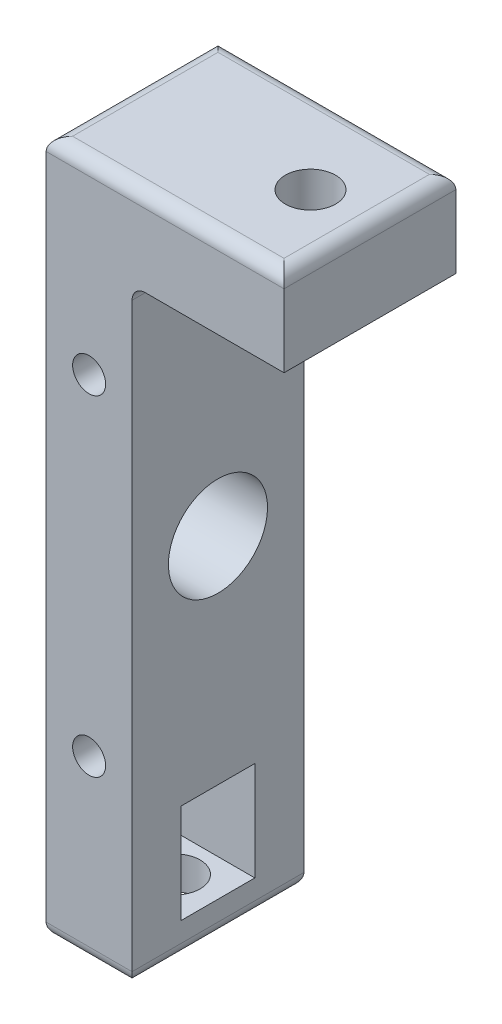
ISO-10303-21;
HEADER;
FILE_DESCRIPTION(('STEP AP214'),'2;1');
FILE_NAME('part.step','',(''),(''),'','','');
FILE_SCHEMA(('AUTOMOTIVE_DESIGN { 1 0 10303 214 1 1 1 1 }'));
ENDSEC;
DATA;
#1=APPLICATION_CONTEXT('core data for automotive mechanical design processes');
#2=APPLICATION_PROTOCOL_DEFINITION('international standard','automotive_design',2000,#1);
#3=PRODUCT_CONTEXT('',#1,'mechanical');
#4=PRODUCT('Part','Part','',(#3));
#5=PRODUCT_RELATED_PRODUCT_CATEGORY('part','',(#4));
#6=PRODUCT_DEFINITION_FORMATION('','',#4);
#7=PRODUCT_DEFINITION_CONTEXT('part definition',#1,'design');
#8=PRODUCT_DEFINITION('design','',#6,#7);
#9=PRODUCT_DEFINITION_SHAPE('','',#8);
#10=(LENGTH_UNIT() NAMED_UNIT(*) SI_UNIT(.MILLI.,.METRE.));
#11=(NAMED_UNIT(*) PLANE_ANGLE_UNIT() SI_UNIT($,.RADIAN.));
#12=(NAMED_UNIT(*) SI_UNIT($,.STERADIAN.) SOLID_ANGLE_UNIT());
#13=UNCERTAINTY_MEASURE_WITH_UNIT(LENGTH_MEASURE(1.E-05),#10,'distance_accuracy_value','');
#14=(GEOMETRIC_REPRESENTATION_CONTEXT(3) GLOBAL_UNCERTAINTY_ASSIGNED_CONTEXT((#13)) GLOBAL_UNIT_ASSIGNED_CONTEXT((#10,
#11,#12)) REPRESENTATION_CONTEXT('',''));
#15=CARTESIAN_POINT('',(0.,0.,0.));
#16=DIRECTION('',(0.,0.,1.));
#17=DIRECTION('',(1.,0.,0.));
#18=AXIS2_PLACEMENT_3D('',#15,#16,#17);
#19=CARTESIAN_POINT('',(0.,-16.51,33.02));
#20=DIRECTION('',(-1.,0.,0.));
#21=DIRECTION('',(0.,0.,1.));
#22=AXIS2_PLACEMENT_3D('',#19,#20,#21);
#23=PLANE('',#22);
#24=DIRECTION('',(0.,1.,0.));
#25=VECTOR('',#24,1.);
#26=CARTESIAN_POINT('',(0.,-16.51,0.));
#27=LINE('',#26,#25);
#28=CARTESIAN_POINT('',(0.,-16.51,0.));
#29=VERTEX_POINT('',#28);
#30=CARTESIAN_POINT('',(0.,-2.54,0.));
#31=VERTEX_POINT('',#30);
#32=EDGE_CURVE('E225',#29,#31,#27,.T.);
#33=ORIENTED_EDGE('',*,*,#32,.T.);
#34=DIRECTION('',(0.,0.,-1.));
#35=VECTOR('',#34,1.);
#36=CARTESIAN_POINT('',(0.,-2.54,33.02));
#37=LINE('',#36,#35);
#38=CARTESIAN_POINT('',(0.,-2.54,33.02));
#39=VERTEX_POINT('',#38);
#40=EDGE_CURVE('E253',#31,#39,#37,.F.);
#41=ORIENTED_EDGE('',*,*,#40,.T.);
#42=DIRECTION('',(0.,1.,0.));
#43=VECTOR('',#42,1.);
#44=CARTESIAN_POINT('',(0.,-16.51,33.02));
#45=LINE('',#44,#43);
#46=CARTESIAN_POINT('',(0.,-16.51,33.02));
#47=VERTEX_POINT('',#46);
#48=EDGE_CURVE('E213',#47,#39,#45,.T.);
#49=ORIENTED_EDGE('',*,*,#48,.F.);
#50=DIRECTION('',(0.,0.,-1.));
#51=VECTOR('',#50,1.);
#52=CARTESIAN_POINT('',(0.,-16.51,33.02));
#53=LINE('',#52,#51);
#54=EDGE_CURVE('E224',#47,#29,#53,.T.);
#55=ORIENTED_EDGE('',*,*,#54,.T.);
#56=EDGE_LOOP('',(#33,#41,#49,#55));
#57=FACE_BOUND('',#56,.T.);
#58=ADVANCED_FACE('F40',(#57),#23,.F.);
#59=CARTESIAN_POINT('',(0.,0.,33.02));
#60=DIRECTION('',(0.,-1.,0.));
#61=DIRECTION('',(1.,0.,0.));
#62=AXIS2_PLACEMENT_3D('',#59,#60,#61);
#63=PLANE('',#62);
#64=CARTESIAN_POINT('',(-11.43,0.,16.51));
#65=DIRECTION('',(0.,1.,0.));
#66=DIRECTION('',(-1.,0.,0.));
#67=AXIS2_PLACEMENT_3D('',#64,#65,#66);
#68=CIRCLE('',#67,4.826);
#69=CARTESIAN_POINT('',(-16.256,0.,16.51));
#70=VERTEX_POINT('',#69);
#71=EDGE_CURVE('E267',#70,#70,#68,.T.);
#72=ORIENTED_EDGE('',*,*,#71,.F.);
#73=EDGE_LOOP('',(#72));
#74=FACE_BOUND('',#73,.T.);
#75=DIRECTION('',(-1.,0.,0.));
#76=VECTOR('',#75,1.);
#77=CARTESIAN_POINT('',(0.,0.,2.54));
#78=LINE('',#77,#76);
#79=CARTESIAN_POINT('',(-2.54,0.,2.54));
#80=VERTEX_POINT('',#79);
#81=CARTESIAN_POINT('',(-43.18,0.,2.54));
#82=VERTEX_POINT('',#81);
#83=EDGE_CURVE('E244',#80,#82,#78,.T.);
#84=ORIENTED_EDGE('',*,*,#83,.T.);
#85=DIRECTION('',(0.,0.,-1.));
#86=VECTOR('',#85,1.);
#87=CARTESIAN_POINT('',(-43.18,0.,33.02));
#88=LINE('',#87,#86);
#89=CARTESIAN_POINT('',(-43.18,0.,30.48));
#90=VERTEX_POINT('',#89);
#91=EDGE_CURVE('E246',#82,#90,#88,.F.);
#92=ORIENTED_EDGE('',*,*,#91,.T.);
#93=DIRECTION('',(-1.,0.,0.));
#94=VECTOR('',#93,1.);
#95=CARTESIAN_POINT('',(0.,0.,30.48));
#96=LINE('',#95,#94);
#97=CARTESIAN_POINT('',(-2.54,0.,30.48));
#98=VERTEX_POINT('',#97);
#99=EDGE_CURVE('E242',#90,#98,#96,.F.);
#100=ORIENTED_EDGE('',*,*,#99,.T.);
#101=DIRECTION('',(0.,0.,-1.));
#102=VECTOR('',#101,1.);
#103=CARTESIAN_POINT('',(-2.54,0.,33.02));
#104=LINE('',#103,#102);
#105=EDGE_CURVE('E240',#98,#80,#104,.T.);
#106=ORIENTED_EDGE('',*,*,#105,.T.);
#107=EDGE_LOOP('',(#84,#92,#100,#106));
#108=FACE_BOUND('',#107,.T.);
#109=ADVANCED_FACE('F324',(#74,#108),#63,.F.);
#110=CARTESIAN_POINT('',(-45.72,0.,33.02));
#111=DIRECTION('',(1.,0.,0.));
#112=DIRECTION('',(0.,1.,0.));
#113=AXIS2_PLACEMENT_3D('',#110,#111,#112);
#114=PLANE('',#113);
#115=DIRECTION('',(0.,0.,-1.));
#116=VECTOR('',#115,1.);
#117=CARTESIAN_POINT('',(-45.72,-127.,23.5966));
#118=LINE('',#117,#116);
#119=CARTESIAN_POINT('',(-45.72,-127.,23.5966));
#120=VERTEX_POINT('',#119);
#121=CARTESIAN_POINT('',(-45.72,-127.,9.42339999999998));
#122=VERTEX_POINT('',#121);
#123=EDGE_CURVE('E159',#120,#122,#118,.T.);
#124=ORIENTED_EDGE('',*,*,#123,.T.);
#125=DIRECTION('',(0.,1.,0.));
#126=VECTOR('',#125,1.);
#127=CARTESIAN_POINT('',(-45.72,-107.95,9.42339999999998));
#128=LINE('',#127,#126);
#129=CARTESIAN_POINT('',(-45.72,-107.95,9.42339999999998));
#130=VERTEX_POINT('',#129);
#131=EDGE_CURVE('E151',#122,#130,#128,.T.);
#132=ORIENTED_EDGE('',*,*,#131,.T.);
#133=DIRECTION('',(0.,0.,1.));
#134=VECTOR('',#133,1.);
#135=CARTESIAN_POINT('',(-45.72,-107.95,23.5966));
#136=LINE('',#135,#134);
#137=CARTESIAN_POINT('',(-45.72,-107.95,23.5966));
#138=VERTEX_POINT('',#137);
#139=EDGE_CURVE('E163',#130,#138,#136,.T.);
#140=ORIENTED_EDGE('',*,*,#139,.T.);
#141=DIRECTION('',(0.,-1.,0.));
#142=VECTOR('',#141,1.);
#143=CARTESIAN_POINT('',(-45.72,-107.95,23.5966));
#144=LINE('',#143,#142);
#145=EDGE_CURVE('E167',#138,#120,#144,.T.);
#146=ORIENTED_EDGE('',*,*,#145,.T.);
#147=EDGE_LOOP('',(#124,#132,#140,#146));
#148=FACE_BOUND('',#147,.T.);
#149=CARTESIAN_POINT('',(-45.72,-66.548,16.51));
#150=DIRECTION('',(1.,0.,0.));
#151=DIRECTION('',(0.,1.,0.));
#152=AXIS2_PLACEMENT_3D('',#149,#150,#151);
#153=CIRCLE('',#152,9.525);
#154=CARTESIAN_POINT('',(-45.72,-57.023,16.51));
#155=VERTEX_POINT('',#154);
#156=EDGE_CURVE('E207',#155,#155,#153,.T.);
#157=ORIENTED_EDGE('',*,*,#156,.T.);
#158=EDGE_LOOP('',(#157));
#159=FACE_BOUND('',#158,.T.);
#160=DIRECTION('',(0.,-1.,0.));
#161=VECTOR('',#160,1.);
#162=CARTESIAN_POINT('',(-45.72,0.,0.));
#163=LINE('',#162,#161);
#164=CARTESIAN_POINT('',(-45.72,-2.54000000000001,0.));
#165=VERTEX_POINT('',#164);
#166=CARTESIAN_POINT('',(-45.72,-130.81,0.));
#167=VERTEX_POINT('',#166);
#168=EDGE_CURVE('E228',#165,#167,#163,.T.);
#169=ORIENTED_EDGE('',*,*,#168,.T.);
#170=DIRECTION('',(0.,0.,-1.));
#171=VECTOR('',#170,1.);
#172=CARTESIAN_POINT('',(-45.72,-130.81,33.02));
#173=LINE('',#172,#171);
#174=CARTESIAN_POINT('',(-45.72,-130.81,33.02));
#175=VERTEX_POINT('',#174);
#176=EDGE_CURVE('E279',#167,#175,#173,.F.);
#177=ORIENTED_EDGE('',*,*,#176,.T.);
#178=DIRECTION('',(0.,-1.,0.));
#179=VECTOR('',#178,1.);
#180=CARTESIAN_POINT('',(-45.72,0.,33.02));
#181=LINE('',#180,#179);
#182=CARTESIAN_POINT('',(-45.72,-2.54000000000001,33.02));
#183=VERTEX_POINT('',#182);
#184=EDGE_CURVE('E216',#183,#175,#181,.T.);
#185=ORIENTED_EDGE('',*,*,#184,.F.);
#186=DIRECTION('',(0.,0.,-1.));
#187=VECTOR('',#186,1.);
#188=CARTESIAN_POINT('',(-45.72,-2.54000000000001,33.02));
#189=LINE('',#188,#187);
#190=EDGE_CURVE('E237',#183,#165,#189,.T.);
#191=ORIENTED_EDGE('',*,*,#190,.T.);
#192=EDGE_LOOP('',(#169,#177,#185,#191));
#193=FACE_BOUND('',#192,.T.);
#194=ADVANCED_FACE('F169',(#148,#159,#193),#114,.F.);
#195=CARTESIAN_POINT('',(-45.72,-133.35,33.02));
#196=DIRECTION('',(0.,1.,0.));
#197=DIRECTION('',(0.,0.,1.));
#198=AXIS2_PLACEMENT_3D('',#195,#196,#197);
#199=PLANE('',#198);
#200=DIRECTION('',(0.,0.,-1.));
#201=VECTOR('',#200,1.);
#202=CARTESIAN_POINT('',(-43.18,-133.35,33.02));
#203=LINE('',#202,#201);
#204=CARTESIAN_POINT('',(-43.18,-133.35,30.48));
#205=VERTEX_POINT('',#204);
#206=CARTESIAN_POINT('',(-43.18,-133.35,2.54));
#207=VERTEX_POINT('',#206);
#208=EDGE_CURVE('E271',#205,#207,#203,.T.);
#209=ORIENTED_EDGE('',*,*,#208,.T.);
#210=DIRECTION('',(1.,0.,0.));
#211=VECTOR('',#210,1.);
#212=CARTESIAN_POINT('',(-45.72,-133.35,2.54));
#213=LINE('',#212,#211);
#214=CARTESIAN_POINT('',(-31.75,-133.35,2.54));
#215=VERTEX_POINT('',#214);
#216=EDGE_CURVE('E273',#207,#215,#213,.T.);
#217=ORIENTED_EDGE('',*,*,#216,.T.);
#218=DIRECTION('',(0.,0.,-1.));
#219=VECTOR('',#218,1.);
#220=CARTESIAN_POINT('',(-31.75,-133.35,33.02));
#221=LINE('',#220,#219);
#222=CARTESIAN_POINT('',(-31.75,-133.35,30.48));
#223=VERTEX_POINT('',#222);
#224=EDGE_CURVE('E255',#215,#223,#221,.F.);
#225=ORIENTED_EDGE('',*,*,#224,.T.);
#226=DIRECTION('',(1.,0.,0.));
#227=VECTOR('',#226,1.);
#228=CARTESIAN_POINT('',(-45.72,-133.35,30.48));
#229=LINE('',#228,#227);
#230=EDGE_CURVE('E269',#223,#205,#229,.F.);
#231=ORIENTED_EDGE('',*,*,#230,.T.);
#232=EDGE_LOOP('',(#209,#217,#225,#231));
#233=FACE_BOUND('',#232,.T.);
#234=CARTESIAN_POINT('',(-37.465,-133.35,16.51));
#235=DIRECTION('',(0.,-1.,0.));
#236=DIRECTION('',(0.,0.,-1.));
#237=AXIS2_PLACEMENT_3D('',#234,#235,#236);
#238=CIRCLE('',#237,4.826);
#239=CARTESIAN_POINT('',(-37.465,-133.35,11.684));
#240=VERTEX_POINT('',#239);
#241=EDGE_CURVE('E178',#240,#240,#238,.T.);
#242=ORIENTED_EDGE('',*,*,#241,.F.);
#243=EDGE_LOOP('',(#242));
#244=FACE_BOUND('',#243,.T.);
#245=ADVANCED_FACE('F355',(#233,#244),#199,.F.);
#246=CARTESIAN_POINT('',(-29.21,-133.35,33.02));
#247=DIRECTION('',(-1.,0.,0.));
#248=DIRECTION('',(0.,-1.,0.));
#249=AXIS2_PLACEMENT_3D('',#246,#247,#248);
#250=PLANE('',#249);
#251=DIRECTION('',(0.,0.,1.));
#252=VECTOR('',#251,1.);
#253=CARTESIAN_POINT('',(-29.21,-107.95,23.5966));
#254=LINE('',#253,#252);
#255=CARTESIAN_POINT('',(-29.21,-107.95,9.42339999999998));
#256=VERTEX_POINT('',#255);
#257=CARTESIAN_POINT('',(-29.21,-107.95,23.5966));
#258=VERTEX_POINT('',#257);
#259=EDGE_CURVE('E184',#256,#258,#254,.T.);
#260=ORIENTED_EDGE('',*,*,#259,.F.);
#261=DIRECTION('',(0.,1.,0.));
#262=VECTOR('',#261,1.);
#263=CARTESIAN_POINT('',(-29.21,-107.95,9.42339999999998));
#264=LINE('',#263,#262);
#265=CARTESIAN_POINT('',(-29.21,-127.,9.42339999999998));
#266=VERTEX_POINT('',#265);
#267=EDGE_CURVE('E154',#266,#256,#264,.T.);
#268=ORIENTED_EDGE('',*,*,#267,.F.);
#269=DIRECTION('',(0.,0.,-1.));
#270=VECTOR('',#269,1.);
#271=CARTESIAN_POINT('',(-29.21,-127.,23.5966));
#272=LINE('',#271,#270);
#273=CARTESIAN_POINT('',(-29.21,-127.,23.5966));
#274=VERTEX_POINT('',#273);
#275=EDGE_CURVE('E172',#274,#266,#272,.T.);
#276=ORIENTED_EDGE('',*,*,#275,.F.);
#277=DIRECTION('',(0.,-1.,0.));
#278=VECTOR('',#277,1.);
#279=CARTESIAN_POINT('',(-29.21,-107.95,23.5966));
#280=LINE('',#279,#278);
#281=EDGE_CURVE('E175',#258,#274,#280,.T.);
#282=ORIENTED_EDGE('',*,*,#281,.F.);
#283=EDGE_LOOP('',(#260,#268,#276,#282));
#284=FACE_BOUND('',#283,.T.);
#285=CARTESIAN_POINT('',(-29.21,-66.548,16.51));
#286=DIRECTION('',(1.,0.,0.));
#287=DIRECTION('',(0.,1.,0.));
#288=AXIS2_PLACEMENT_3D('',#285,#286,#287);
#289=CIRCLE('',#288,9.525);
#290=CARTESIAN_POINT('',(-29.21,-57.023,16.51));
#291=VERTEX_POINT('',#290);
#292=EDGE_CURVE('E198',#291,#291,#289,.T.);
#293=ORIENTED_EDGE('',*,*,#292,.F.);
#294=EDGE_LOOP('',(#293));
#295=FACE_BOUND('',#294,.T.);
#296=DIRECTION('',(0.,1.,0.));
#297=VECTOR('',#296,1.);
#298=CARTESIAN_POINT('',(-29.21,-133.35,0.));
#299=LINE('',#298,#297);
#300=CARTESIAN_POINT('',(-29.21,-130.81,0.));
#301=VERTEX_POINT('',#300);
#302=CARTESIAN_POINT('',(-29.21,-19.05,0.));
#303=VERTEX_POINT('',#302);
#304=EDGE_CURVE('E232',#301,#303,#299,.T.);
#305=ORIENTED_EDGE('',*,*,#304,.T.);
#306=DIRECTION('',(0.,0.,-1.));
#307=VECTOR('',#306,1.);
#308=CARTESIAN_POINT('',(-29.21,-19.05,33.02));
#309=LINE('',#308,#307);
#310=CARTESIAN_POINT('',(-29.21,-19.05,33.02));
#311=VERTEX_POINT('',#310);
#312=EDGE_CURVE('E61',#303,#311,#309,.F.);
#313=ORIENTED_EDGE('',*,*,#312,.T.);
#314=DIRECTION('',(0.,1.,0.));
#315=VECTOR('',#314,1.);
#316=CARTESIAN_POINT('',(-29.21,-133.35,33.02));
#317=LINE('',#316,#315);
#318=CARTESIAN_POINT('',(-29.21,-130.81,33.02));
#319=VERTEX_POINT('',#318);
#320=EDGE_CURVE('E220',#319,#311,#317,.T.);
#321=ORIENTED_EDGE('',*,*,#320,.F.);
#322=DIRECTION('',(0.,0.,-1.));
#323=VECTOR('',#322,1.);
#324=CARTESIAN_POINT('',(-29.21,-130.81,33.02));
#325=LINE('',#324,#323);
#326=EDGE_CURVE('E283',#319,#301,#325,.T.);
#327=ORIENTED_EDGE('',*,*,#326,.T.);
#328=EDGE_LOOP('',(#305,#313,#321,#327));
#329=FACE_BOUND('',#328,.T.);
#330=ADVANCED_FACE('F359',(#284,#295,#329),#250,.F.);
#331=CARTESIAN_POINT('',(-29.21,-16.51,33.02));
#332=DIRECTION('',(0.,1.,0.));
#333=DIRECTION('',(0.,0.,1.));
#334=AXIS2_PLACEMENT_3D('',#331,#332,#333);
#335=PLANE('',#334);
#336=CARTESIAN_POINT('',(-11.43,-16.51,16.51));
#337=DIRECTION('',(0.,1.,0.));
#338=DIRECTION('',(0.,0.,1.));
#339=AXIS2_PLACEMENT_3D('',#336,#337,#338);
#340=CIRCLE('',#339,4.826);
#341=CARTESIAN_POINT('',(-11.43,-16.51,21.336));
#342=VERTEX_POINT('',#341);
#343=EDGE_CURVE('E264',#342,#342,#340,.T.);
#344=ORIENTED_EDGE('',*,*,#343,.T.);
#345=EDGE_LOOP('',(#344));
#346=FACE_BOUND('',#345,.T.);
#347=DIRECTION('',(1.,0.,0.));
#348=VECTOR('',#347,1.);
#349=CARTESIAN_POINT('',(-29.21,-16.51,33.02));
#350=LINE('',#349,#348);
#351=CARTESIAN_POINT('',(-26.67,-16.51,33.02));
#352=VERTEX_POINT('',#351);
#353=EDGE_CURVE('E222',#352,#47,#350,.T.);
#354=ORIENTED_EDGE('',*,*,#353,.F.);
#355=DIRECTION('',(0.,0.,-1.));
#356=VECTOR('',#355,1.);
#357=CARTESIAN_POINT('',(-26.67,-16.51,0.));
#358=LINE('',#357,#356);
#359=CARTESIAN_POINT('',(-26.67,-16.51,0.));
#360=VERTEX_POINT('',#359);
#361=EDGE_CURVE('E285',#352,#360,#358,.T.);
#362=ORIENTED_EDGE('',*,*,#361,.T.);
#363=DIRECTION('',(1.,0.,0.));
#364=VECTOR('',#363,1.);
#365=CARTESIAN_POINT('',(-29.21,-16.51,0.));
#366=LINE('',#365,#364);
#367=EDGE_CURVE('E217',#360,#29,#366,.T.);
#368=ORIENTED_EDGE('',*,*,#367,.T.);
#369=ORIENTED_EDGE('',*,*,#54,.F.);
#370=EDGE_LOOP('',(#354,#362,#368,#369));
#371=FACE_BOUND('',#370,.T.);
#372=ADVANCED_FACE('F301',(#346,#371),#335,.F.);
#373=CARTESIAN_POINT('',(0.,0.,33.02));
#374=DIRECTION('',(0.,0.,1.));
#375=DIRECTION('',(1.,0.,0.));
#376=AXIS2_PLACEMENT_3D('',#373,#374,#375);
#377=PLANE('',#376);
#378=CARTESIAN_POINT('',(-37.465,-35.56,33.02));
#379=DIRECTION('',(0.,0.,1.));
#380=DIRECTION('',(1.,0.,0.));
#381=AXIS2_PLACEMENT_3D('',#378,#379,#380);
#382=CIRCLE('',#381,3.175);
#383=CARTESIAN_POINT('',(-34.29,-35.56,33.02));
#384=VERTEX_POINT('',#383);
#385=EDGE_CURVE('E199',#384,#384,#382,.T.);
#386=ORIENTED_EDGE('',*,*,#385,.F.);
#387=EDGE_LOOP('',(#386));
#388=FACE_BOUND('',#387,.T.);
#389=CARTESIAN_POINT('',(-37.465,-99.06,33.02));
#390=DIRECTION('',(0.,0.,1.));
#391=DIRECTION('',(1.,0.,0.));
#392=AXIS2_PLACEMENT_3D('',#389,#390,#391);
#393=CIRCLE('',#392,3.175);
#394=CARTESIAN_POINT('',(-34.29,-99.06,33.02));
#395=VERTEX_POINT('',#394);
#396=EDGE_CURVE('E191',#395,#395,#393,.T.);
#397=ORIENTED_EDGE('',*,*,#396,.F.);
#398=EDGE_LOOP('',(#397));
#399=FACE_BOUND('',#398,.T.);
#400=ORIENTED_EDGE('',*,*,#184,.T.);
#401=DIRECTION('',(1.,0.,0.));
#402=VECTOR('',#401,1.);
#403=CARTESIAN_POINT('',(-29.21,-130.81,33.02));
#404=LINE('',#403,#402);
#405=EDGE_CURVE('E281',#175,#319,#404,.T.);
#406=ORIENTED_EDGE('',*,*,#405,.T.);
#407=ORIENTED_EDGE('',*,*,#320,.T.);
#408=CARTESIAN_POINT('',(-26.67,-19.05,33.02));
#409=DIRECTION('',(0.,0.,1.));
#410=DIRECTION('',(1.,0.,0.));
#411=AXIS2_PLACEMENT_3D('',#408,#409,#410);
#412=CIRCLE('',#411,2.54);
#413=EDGE_CURVE('E11',#311,#352,#412,.F.);
#414=ORIENTED_EDGE('',*,*,#413,.T.);
#415=ORIENTED_EDGE('',*,*,#353,.T.);
#416=ORIENTED_EDGE('',*,*,#48,.T.);
#417=DIRECTION('',(-1.,0.,0.));
#418=VECTOR('',#417,1.);
#419=CARTESIAN_POINT('',(-45.72,-2.54000000000001,33.02));
#420=LINE('',#419,#418);
#421=EDGE_CURVE('E251',#39,#183,#420,.T.);
#422=ORIENTED_EDGE('',*,*,#421,.T.);
#423=EDGE_LOOP('',(#400,#406,#407,#414,#415,#416,#422));
#424=FACE_BOUND('',#423,.T.);
#425=ADVANCED_FACE('F334',(#388,#399,#424),#377,.T.);
#426=CARTESIAN_POINT('',(0.,0.,0.));
#427=DIRECTION('',(0.,0.,1.));
#428=DIRECTION('',(1.,0.,0.));
#429=AXIS2_PLACEMENT_3D('',#426,#427,#428);
#430=PLANE('',#429);
#431=CARTESIAN_POINT('',(-37.465,-35.56,0.));
#432=DIRECTION('',(0.,0.,1.));
#433=DIRECTION('',(1.,0.,0.));
#434=AXIS2_PLACEMENT_3D('',#431,#432,#433);
#435=CIRCLE('',#434,3.175);
#436=CARTESIAN_POINT('',(-34.29,-35.56,0.));
#437=VERTEX_POINT('',#436);
#438=EDGE_CURVE('E195',#437,#437,#435,.T.);
#439=ORIENTED_EDGE('',*,*,#438,.T.);
#440=EDGE_LOOP('',(#439));
#441=FACE_BOUND('',#440,.T.);
#442=CARTESIAN_POINT('',(-37.465,-99.06,0.));
#443=DIRECTION('',(0.,0.,1.));
#444=DIRECTION('',(1.,0.,0.));
#445=AXIS2_PLACEMENT_3D('',#442,#443,#444);
#446=CIRCLE('',#445,3.175);
#447=CARTESIAN_POINT('',(-34.29,-99.06,0.));
#448=VERTEX_POINT('',#447);
#449=EDGE_CURVE('E202',#448,#448,#446,.T.);
#450=ORIENTED_EDGE('',*,*,#449,.T.);
#451=EDGE_LOOP('',(#450));
#452=FACE_BOUND('',#451,.T.);
#453=ORIENTED_EDGE('',*,*,#304,.F.);
#454=DIRECTION('',(1.,0.,0.));
#455=VECTOR('',#454,1.);
#456=CARTESIAN_POINT('',(0.,-130.81,0.));
#457=LINE('',#456,#455);
#458=EDGE_CURVE('E276',#301,#167,#457,.F.);
#459=ORIENTED_EDGE('',*,*,#458,.T.);
#460=ORIENTED_EDGE('',*,*,#168,.F.);
#461=DIRECTION('',(-1.,0.,0.));
#462=VECTOR('',#461,1.);
#463=CARTESIAN_POINT('',(0.,-2.54,0.));
#464=LINE('',#463,#462);
#465=EDGE_CURVE('E249',#165,#31,#464,.F.);
#466=ORIENTED_EDGE('',*,*,#465,.T.);
#467=ORIENTED_EDGE('',*,*,#32,.F.);
#468=ORIENTED_EDGE('',*,*,#367,.F.);
#469=CARTESIAN_POINT('',(-26.67,-19.05,0.));
#470=DIRECTION('',(0.,0.,1.));
#471=DIRECTION('',(1.,0.,0.));
#472=AXIS2_PLACEMENT_3D('',#469,#470,#471);
#473=CIRCLE('',#472,2.54);
#474=EDGE_CURVE('E48',#360,#303,#473,.T.);
#475=ORIENTED_EDGE('',*,*,#474,.T.);
#476=EDGE_LOOP('',(#453,#459,#460,#466,#467,#468,#475));
#477=FACE_BOUND('',#476,.T.);
#478=ADVANCED_FACE('F306',(#441,#452,#477),#430,.F.);
#479=CARTESIAN_POINT('',(-2.54,-2.54,33.02));
#480=DIRECTION('',(0.,0.,-1.));
#481=DIRECTION('',(-1.,0.,0.));
#482=AXIS2_PLACEMENT_3D('',#479,#480,#481);
#483=CYLINDRICAL_SURFACE('',#482,2.54);
#484=CARTESIAN_POINT('',(-2.54,-2.54,2.54));
#485=DIRECTION('',(-0.707106781186547,0.,-0.707106781186547));
#486=DIRECTION('',(0.707106781186547,0.,-0.707106781186547));
#487=AXIS2_PLACEMENT_3D('',#484,#485,#486);
#488=ELLIPSE('',#487,3.59210244842766,2.54);
#489=EDGE_CURVE('E259',#80,#31,#488,.T.);
#490=ORIENTED_EDGE('',*,*,#489,.F.);
#491=ORIENTED_EDGE('',*,*,#105,.F.);
#492=CARTESIAN_POINT('',(-2.54,-2.54,30.48));
#493=DIRECTION('',(0.707106781186547,0.,-0.707106781186547));
#494=DIRECTION('',(-0.707106781186547,0.,-0.707106781186547));
#495=AXIS2_PLACEMENT_3D('',#492,#493,#494);
#496=ELLIPSE('',#495,3.59210244842766,2.54);
#497=EDGE_CURVE('E229',#39,#98,#496,.F.);
#498=ORIENTED_EDGE('',*,*,#497,.F.);
#499=ORIENTED_EDGE('',*,*,#40,.F.);
#500=EDGE_LOOP('',(#490,#491,#498,#499));
#501=FACE_BOUND('',#500,.T.);
#502=ADVANCED_FACE('F315',(#501),#483,.T.);
#503=CARTESIAN_POINT('',(0.,-2.54,30.48));
#504=DIRECTION('',(1.,0.,0.));
#505=DIRECTION('',(0.,1.,0.));
#506=AXIS2_PLACEMENT_3D('',#503,#504,#505);
#507=CYLINDRICAL_SURFACE('',#506,2.54);
#508=ORIENTED_EDGE('',*,*,#497,.T.);
#509=ORIENTED_EDGE('',*,*,#99,.F.);
#510=CARTESIAN_POINT('',(-43.18,-2.54000000000001,30.48));
#511=DIRECTION('',(0.707106781186547,0.,0.707106781186547));
#512=DIRECTION('',(0.707106781186547,0.,-0.707106781186547));
#513=AXIS2_PLACEMENT_3D('',#510,#511,#512);
#514=ELLIPSE('',#513,3.59210244842766,2.54);
#515=EDGE_CURVE('E257',#183,#90,#514,.F.);
#516=ORIENTED_EDGE('',*,*,#515,.F.);
#517=ORIENTED_EDGE('',*,*,#421,.F.);
#518=EDGE_LOOP('',(#508,#509,#516,#517));
#519=FACE_BOUND('',#518,.T.);
#520=ADVANCED_FACE('F331',(#519),#507,.T.);
#521=CARTESIAN_POINT('',(0.,-2.54,2.54));
#522=DIRECTION('',(-1.,0.,0.));
#523=DIRECTION('',(0.,-1.,0.));
#524=AXIS2_PLACEMENT_3D('',#521,#522,#523);
#525=CYLINDRICAL_SURFACE('',#524,2.54);
#526=ORIENTED_EDGE('',*,*,#489,.T.);
#527=ORIENTED_EDGE('',*,*,#465,.F.);
#528=CARTESIAN_POINT('',(-43.18,-2.54000000000001,2.54));
#529=DIRECTION('',(-0.707106781186547,0.,0.707106781186547));
#530=DIRECTION('',(-0.707106781186547,0.,-0.707106781186547));
#531=AXIS2_PLACEMENT_3D('',#528,#529,#530);
#532=ELLIPSE('',#531,3.59210244842766,2.54);
#533=EDGE_CURVE('E210',#82,#165,#532,.T.);
#534=ORIENTED_EDGE('',*,*,#533,.F.);
#535=ORIENTED_EDGE('',*,*,#83,.F.);
#536=EDGE_LOOP('',(#526,#527,#534,#535));
#537=FACE_BOUND('',#536,.T.);
#538=ADVANCED_FACE('F320',(#537),#525,.T.);
#539=CARTESIAN_POINT('',(-43.18,-2.54000000000001,33.02));
#540=DIRECTION('',(0.,0.,-1.));
#541=DIRECTION('',(-1.,0.,0.));
#542=AXIS2_PLACEMENT_3D('',#539,#540,#541);
#543=CYLINDRICAL_SURFACE('',#542,2.54);
#544=ORIENTED_EDGE('',*,*,#515,.T.);
#545=ORIENTED_EDGE('',*,*,#91,.F.);
#546=ORIENTED_EDGE('',*,*,#533,.T.);
#547=ORIENTED_EDGE('',*,*,#190,.F.);
#548=EDGE_LOOP('',(#544,#545,#546,#547));
#549=FACE_BOUND('',#548,.T.);
#550=ADVANCED_FACE('F326',(#549),#543,.T.);
#551=CARTESIAN_POINT('',(-45.72,-66.548,16.51));
#552=DIRECTION('',(1.,0.,0.));
#553=DIRECTION('',(0.,1.,0.));
#554=AXIS2_PLACEMENT_3D('',#551,#552,#553);
#555=CYLINDRICAL_SURFACE('',#554,9.525);
#556=ORIENTED_EDGE('',*,*,#156,.F.);
#557=EDGE_LOOP('',(#556));
#558=FACE_BOUND('',#557,.T.);
#559=ORIENTED_EDGE('',*,*,#292,.T.);
#560=EDGE_LOOP('',(#559));
#561=FACE_BOUND('',#560,.T.);
#562=ADVANCED_FACE('F376',(#558,#561),#555,.F.);
#563=CARTESIAN_POINT('',(-37.465,-99.06,0.));
#564=DIRECTION('',(0.,0.,1.));
#565=DIRECTION('',(1.,0.,0.));
#566=AXIS2_PLACEMENT_3D('',#563,#564,#565);
#567=CYLINDRICAL_SURFACE('',#566,3.175);
#568=ORIENTED_EDGE('',*,*,#449,.F.);
#569=EDGE_LOOP('',(#568));
#570=FACE_BOUND('',#569,.T.);
#571=ORIENTED_EDGE('',*,*,#396,.T.);
#572=EDGE_LOOP('',(#571));
#573=FACE_BOUND('',#572,.T.);
#574=ADVANCED_FACE('F417',(#570,#573),#567,.F.);
#575=CARTESIAN_POINT('',(-37.465,-35.56,0.));
#576=DIRECTION('',(0.,0.,1.));
#577=DIRECTION('',(1.,0.,0.));
#578=AXIS2_PLACEMENT_3D('',#575,#576,#577);
#579=CYLINDRICAL_SURFACE('',#578,3.175);
#580=ORIENTED_EDGE('',*,*,#438,.F.);
#581=EDGE_LOOP('',(#580));
#582=FACE_BOUND('',#581,.T.);
#583=ORIENTED_EDGE('',*,*,#385,.T.);
#584=EDGE_LOOP('',(#583));
#585=FACE_BOUND('',#584,.T.);
#586=ADVANCED_FACE('F414',(#582,#585),#579,.F.);
#587=CARTESIAN_POINT('',(-45.72,-107.95,9.42339999999998));
#588=DIRECTION('',(0.,0.,-1.));
#589=DIRECTION('',(0.,1.,0.));
#590=AXIS2_PLACEMENT_3D('',#587,#588,#589);
#591=PLANE('',#590);
#592=ORIENTED_EDGE('',*,*,#267,.T.);
#593=DIRECTION('',(1.,0.,0.));
#594=VECTOR('',#593,1.);
#595=CARTESIAN_POINT('',(-45.72,-107.95,9.42339999999998));
#596=LINE('',#595,#594);
#597=EDGE_CURVE('E147',#130,#256,#596,.T.);
#598=ORIENTED_EDGE('',*,*,#597,.F.);
#599=ORIENTED_EDGE('',*,*,#131,.F.);
#600=DIRECTION('',(1.,0.,0.));
#601=VECTOR('',#600,1.);
#602=CARTESIAN_POINT('',(-45.72,-127.,9.42339999999998));
#603=LINE('',#602,#601);
#604=EDGE_CURVE('E189',#122,#266,#603,.T.);
#605=ORIENTED_EDGE('',*,*,#604,.T.);
#606=EDGE_LOOP('',(#592,#598,#599,#605));
#607=FACE_BOUND('',#606,.T.);
#608=ADVANCED_FACE('F149',(#607),#591,.F.);
#609=CARTESIAN_POINT('',(-45.72,-127.,23.5966));
#610=DIRECTION('',(0.,-1.,0.));
#611=DIRECTION('',(1.,0.,0.));
#612=AXIS2_PLACEMENT_3D('',#609,#610,#611);
#613=PLANE('',#612);
#614=CARTESIAN_POINT('',(-37.465,-127.,16.51));
#615=DIRECTION('',(0.,-1.,0.));
#616=DIRECTION('',(0.,0.,-1.));
#617=AXIS2_PLACEMENT_3D('',#614,#615,#616);
#618=CIRCLE('',#617,4.826);
#619=CARTESIAN_POINT('',(-37.465,-127.,11.684));
#620=VERTEX_POINT('',#619);
#621=EDGE_CURVE('E185',#620,#620,#618,.T.);
#622=ORIENTED_EDGE('',*,*,#621,.T.);
#623=EDGE_LOOP('',(#622));
#624=FACE_BOUND('',#623,.T.);
#625=ORIENTED_EDGE('',*,*,#275,.T.);
#626=ORIENTED_EDGE('',*,*,#604,.F.);
#627=ORIENTED_EDGE('',*,*,#123,.F.);
#628=DIRECTION('',(1.,0.,0.));
#629=VECTOR('',#628,1.);
#630=CARTESIAN_POINT('',(-45.72,-127.,23.5966));
#631=LINE('',#630,#629);
#632=EDGE_CURVE('E192',#120,#274,#631,.T.);
#633=ORIENTED_EDGE('',*,*,#632,.T.);
#634=EDGE_LOOP('',(#625,#626,#627,#633));
#635=FACE_BOUND('',#634,.T.);
#636=ADVANCED_FACE('F402',(#624,#635),#613,.F.);
#637=CARTESIAN_POINT('',(-45.72,-107.95,23.5966));
#638=DIRECTION('',(0.,0.,1.));
#639=DIRECTION('',(1.,0.,0.));
#640=AXIS2_PLACEMENT_3D('',#637,#638,#639);
#641=PLANE('',#640);
#642=ORIENTED_EDGE('',*,*,#281,.T.);
#643=ORIENTED_EDGE('',*,*,#632,.F.);
#644=ORIENTED_EDGE('',*,*,#145,.F.);
#645=DIRECTION('',(1.,0.,0.));
#646=VECTOR('',#645,1.);
#647=CARTESIAN_POINT('',(-45.72,-107.95,23.5966));
#648=LINE('',#647,#646);
#649=EDGE_CURVE('E158',#138,#258,#648,.T.);
#650=ORIENTED_EDGE('',*,*,#649,.T.);
#651=EDGE_LOOP('',(#642,#643,#644,#650));
#652=FACE_BOUND('',#651,.T.);
#653=ADVANCED_FACE('F405',(#652),#641,.F.);
#654=CARTESIAN_POINT('',(-45.72,-107.95,23.5966));
#655=DIRECTION('',(0.,1.,0.));
#656=DIRECTION('',(-1.,0.,0.));
#657=AXIS2_PLACEMENT_3D('',#654,#655,#656);
#658=PLANE('',#657);
#659=ORIENTED_EDGE('',*,*,#259,.T.);
#660=ORIENTED_EDGE('',*,*,#649,.F.);
#661=ORIENTED_EDGE('',*,*,#139,.F.);
#662=ORIENTED_EDGE('',*,*,#597,.T.);
#663=EDGE_LOOP('',(#659,#660,#661,#662));
#664=FACE_BOUND('',#663,.T.);
#665=ADVANCED_FACE('F164',(#664),#658,.F.);
#666=CARTESIAN_POINT('',(-37.465,-127.,16.51));
#667=DIRECTION('',(0.,-1.,0.));
#668=DIRECTION('',(0.,0.,-1.));
#669=AXIS2_PLACEMENT_3D('',#666,#667,#668);
#670=CYLINDRICAL_SURFACE('',#669,4.826);
#671=ORIENTED_EDGE('',*,*,#621,.F.);
#672=EDGE_LOOP('',(#671));
#673=FACE_BOUND('',#672,.T.);
#674=ORIENTED_EDGE('',*,*,#241,.T.);
#675=EDGE_LOOP('',(#674));
#676=FACE_BOUND('',#675,.T.);
#677=ADVANCED_FACE('F391',(#673,#676),#670,.F.);
#678=CARTESIAN_POINT('',(-11.43,-133.35,16.51));
#679=DIRECTION('',(0.,1.,0.));
#680=DIRECTION('',(-1.,0.,0.));
#681=AXIS2_PLACEMENT_3D('',#678,#679,#680);
#682=CYLINDRICAL_SURFACE('',#681,4.826);
#683=ORIENTED_EDGE('',*,*,#71,.T.);
#684=EDGE_LOOP('',(#683));
#685=FACE_BOUND('',#684,.T.);
#686=ORIENTED_EDGE('',*,*,#343,.F.);
#687=EDGE_LOOP('',(#686));
#688=FACE_BOUND('',#687,.T.);
#689=ADVANCED_FACE('F387',(#685,#688),#682,.F.);
#690=CARTESIAN_POINT('',(0.,-130.81,30.48));
#691=DIRECTION('',(-1.,0.,0.));
#692=DIRECTION('',(0.,0.,1.));
#693=AXIS2_PLACEMENT_3D('',#690,#691,#692);
#694=CYLINDRICAL_SURFACE('',#693,2.54);
#695=CARTESIAN_POINT('',(-31.75,-130.81,30.48));
#696=DIRECTION('',(0.707106781186547,0.,-0.707106781186547));
#697=DIRECTION('',(-0.707106781186547,0.,-0.707106781186547));
#698=AXIS2_PLACEMENT_3D('',#695,#696,#697);
#699=ELLIPSE('',#698,3.59210244842766,2.54);
#700=EDGE_CURVE('E290',#319,#223,#699,.T.);
#701=ORIENTED_EDGE('',*,*,#700,.F.);
#702=ORIENTED_EDGE('',*,*,#405,.F.);
#703=CARTESIAN_POINT('',(-43.18,-130.81,30.48));
#704=DIRECTION('',(-0.707106781186547,0.,-0.707106781186547));
#705=DIRECTION('',(-0.707106781186547,0.,0.707106781186547));
#706=AXIS2_PLACEMENT_3D('',#703,#704,#705);
#707=ELLIPSE('',#706,3.59210244842766,2.54);
#708=EDGE_CURVE('E293',#205,#175,#707,.T.);
#709=ORIENTED_EDGE('',*,*,#708,.F.);
#710=ORIENTED_EDGE('',*,*,#230,.F.);
#711=EDGE_LOOP('',(#701,#702,#709,#710));
#712=FACE_BOUND('',#711,.T.);
#713=ADVANCED_FACE('F358',(#712),#694,.T.);
#714=CARTESIAN_POINT('',(-43.18,-130.81,33.02));
#715=DIRECTION('',(0.,0.,-1.));
#716=DIRECTION('',(-1.,0.,0.));
#717=AXIS2_PLACEMENT_3D('',#714,#715,#716);
#718=CYLINDRICAL_SURFACE('',#717,2.54);
#719=ORIENTED_EDGE('',*,*,#708,.T.);
#720=ORIENTED_EDGE('',*,*,#176,.F.);
#721=CARTESIAN_POINT('',(-43.18,-130.81,2.54));
#722=DIRECTION('',(0.707106781186547,0.,-0.707106781186547));
#723=DIRECTION('',(-0.707106781186547,0.,-0.707106781186547));
#724=AXIS2_PLACEMENT_3D('',#721,#722,#723);
#725=ELLIPSE('',#724,3.59210244842766,2.54);
#726=EDGE_CURVE('E288',#207,#167,#725,.T.);
#727=ORIENTED_EDGE('',*,*,#726,.F.);
#728=ORIENTED_EDGE('',*,*,#208,.F.);
#729=EDGE_LOOP('',(#719,#720,#727,#728));
#730=FACE_BOUND('',#729,.T.);
#731=ADVANCED_FACE('F340',(#730),#718,.T.);
#732=CARTESIAN_POINT('',(-31.75,-130.81,33.02));
#733=DIRECTION('',(0.,0.,-1.));
#734=DIRECTION('',(-1.,0.,0.));
#735=AXIS2_PLACEMENT_3D('',#732,#733,#734);
#736=CYLINDRICAL_SURFACE('',#735,2.54);
#737=ORIENTED_EDGE('',*,*,#700,.T.);
#738=ORIENTED_EDGE('',*,*,#224,.F.);
#739=CARTESIAN_POINT('',(-31.75,-130.81,2.54));
#740=DIRECTION('',(-0.707106781186547,0.,-0.707106781186547));
#741=DIRECTION('',(0.707106781186547,0.,-0.707106781186547));
#742=AXIS2_PLACEMENT_3D('',#739,#740,#741);
#743=ELLIPSE('',#742,3.59210244842766,2.54);
#744=EDGE_CURVE('E286',#301,#215,#743,.T.);
#745=ORIENTED_EDGE('',*,*,#744,.F.);
#746=ORIENTED_EDGE('',*,*,#326,.F.);
#747=EDGE_LOOP('',(#737,#738,#745,#746));
#748=FACE_BOUND('',#747,.T.);
#749=ADVANCED_FACE('F351',(#748),#736,.T.);
#750=CARTESIAN_POINT('',(-45.72,-130.81,2.54));
#751=DIRECTION('',(1.,0.,0.));
#752=DIRECTION('',(0.,0.,-1.));
#753=AXIS2_PLACEMENT_3D('',#750,#751,#752);
#754=CYLINDRICAL_SURFACE('',#753,2.54);
#755=ORIENTED_EDGE('',*,*,#726,.T.);
#756=ORIENTED_EDGE('',*,*,#458,.F.);
#757=ORIENTED_EDGE('',*,*,#744,.T.);
#758=ORIENTED_EDGE('',*,*,#216,.F.);
#759=EDGE_LOOP('',(#755,#756,#757,#758));
#760=FACE_BOUND('',#759,.T.);
#761=ADVANCED_FACE('F347',(#760),#754,.T.);
#762=CARTESIAN_POINT('',(-26.67,-19.05,33.02));
#763=DIRECTION('',(0.,0.,1.));
#764=DIRECTION('',(1.,0.,0.));
#765=AXIS2_PLACEMENT_3D('',#762,#763,#764);
#766=CYLINDRICAL_SURFACE('',#765,2.54);
#767=ORIENTED_EDGE('',*,*,#413,.F.);
#768=ORIENTED_EDGE('',*,*,#312,.F.);
#769=ORIENTED_EDGE('',*,*,#474,.F.);
#770=ORIENTED_EDGE('',*,*,#361,.F.);
#771=EDGE_LOOP('',(#767,#768,#769,#770));
#772=FACE_BOUND('',#771,.T.);
#773=ADVANCED_FACE('F42',(#772),#766,.F.);
#774=CLOSED_SHELL('',(#58,#109,#194,#245,#330,#372,#425,#478,#502,#520,#538,#550,#562,#574,#586,
#608,#636,#653,#665,#677,#689,#713,#731,#749,#761,#773));
#775=MANIFOLD_SOLID_BREP('B2',#774);
#776=ADVANCED_BREP_SHAPE_REPRESENTATION('',(#18,#775),#14);
#777=SHAPE_DEFINITION_REPRESENTATION(#9,#776);
ENDSEC;
END-ISO-10303-21;
